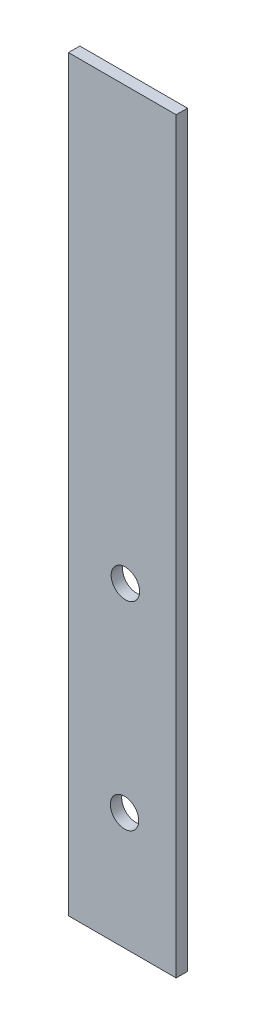
ISO-10303-21;
HEADER;
FILE_DESCRIPTION(('STEP AP214'),'2;1');
FILE_NAME('part.step','',(''),(''),'','','');
FILE_SCHEMA(('AUTOMOTIVE_DESIGN { 1 0 10303 214 1 1 1 1 }'));
ENDSEC;
DATA;
#1=APPLICATION_CONTEXT('core data for automotive mechanical design processes');
#2=APPLICATION_PROTOCOL_DEFINITION('international standard','automotive_design',2000,#1);
#3=PRODUCT_CONTEXT('',#1,'mechanical');
#4=PRODUCT('Part','Part','',(#3));
#5=PRODUCT_RELATED_PRODUCT_CATEGORY('part','',(#4));
#6=PRODUCT_DEFINITION_FORMATION('','',#4);
#7=PRODUCT_DEFINITION_CONTEXT('part definition',#1,'design');
#8=PRODUCT_DEFINITION('design','',#6,#7);
#9=PRODUCT_DEFINITION_SHAPE('','',#8);
#10=(LENGTH_UNIT() NAMED_UNIT(*) SI_UNIT(.MILLI.,.METRE.));
#11=(NAMED_UNIT(*) PLANE_ANGLE_UNIT() SI_UNIT($,.RADIAN.));
#12=(NAMED_UNIT(*) SI_UNIT($,.STERADIAN.) SOLID_ANGLE_UNIT());
#13=UNCERTAINTY_MEASURE_WITH_UNIT(LENGTH_MEASURE(1.E-05),#10,'distance_accuracy_value','');
#14=(GEOMETRIC_REPRESENTATION_CONTEXT(3) GLOBAL_UNCERTAINTY_ASSIGNED_CONTEXT((#13)) GLOBAL_UNIT_ASSIGNED_CONTEXT((#10,
#11,#12)) REPRESENTATION_CONTEXT('',''));
#15=CARTESIAN_POINT('',(0.,0.,0.));
#16=DIRECTION('',(0.,0.,1.));
#17=DIRECTION('',(1.,0.,0.));
#18=AXIS2_PLACEMENT_3D('',#15,#16,#17);
#19=CARTESIAN_POINT('',(0.,0.,4.));
#20=DIRECTION('',(0.,0.,-1.));
#21=DIRECTION('',(-1.,0.,0.));
#22=AXIS2_PLACEMENT_3D('',#19,#20,#21);
#23=PLANE('',#22);
#24=DIRECTION('',(0.,-1.,0.));
#25=VECTOR('',#24,1.);
#26=CARTESIAN_POINT('',(-231.365418272588,-64.4964861712343,4.));
#27=LINE('',#26,#25);
#28=CARTESIAN_POINT('',(-231.365418272588,198.594281617717,4.));
#29=VERTEX_POINT('',#28);
#30=CARTESIAN_POINT('',(-231.365418272588,-64.4964861712343,4.));
#31=VERTEX_POINT('',#30);
#32=EDGE_CURVE('E94',#29,#31,#27,.T.);
#33=ORIENTED_EDGE('',*,*,#32,.T.);
#34=DIRECTION('',(1.,0.,0.));
#35=VECTOR('',#34,1.);
#36=CARTESIAN_POINT('',(-193.465418272588,-64.4964861712342,4.));
#37=LINE('',#36,#35);
#38=CARTESIAN_POINT('',(-193.465418272588,-64.4964861712342,4.));
#39=VERTEX_POINT('',#38);
#40=EDGE_CURVE('E89',#31,#39,#37,.T.);
#41=ORIENTED_EDGE('',*,*,#40,.T.);
#42=DIRECTION('',(0.,1.,0.));
#43=VECTOR('',#42,1.);
#44=CARTESIAN_POINT('',(-193.465418272588,198.594281617717,4.));
#45=LINE('',#44,#43);
#46=CARTESIAN_POINT('',(-193.465418272588,198.594281617717,4.));
#47=VERTEX_POINT('',#46);
#48=EDGE_CURVE('E92',#39,#47,#45,.T.);
#49=ORIENTED_EDGE('',*,*,#48,.T.);
#50=DIRECTION('',(-1.,0.,0.));
#51=VECTOR('',#50,1.);
#52=CARTESIAN_POINT('',(-231.365418272588,198.594281617717,4.));
#53=LINE('',#52,#51);
#54=EDGE_CURVE('E59',#47,#29,#53,.T.);
#55=ORIENTED_EDGE('',*,*,#54,.T.);
#56=EDGE_LOOP('',(#33,#41,#49,#55));
#57=FACE_BOUND('',#56,.T.);
#58=CARTESIAN_POINT('',(-211.634282691747,-23.1738254373147,4.));
#59=DIRECTION('',(0.,0.,1.));
#60=DIRECTION('',(1.,0.,0.));
#61=AXIS2_PLACEMENT_3D('',#58,#59,#60);
#62=CIRCLE('',#61,5.00000000000772);
#63=CARTESIAN_POINT('',(-206.63428269174,-23.1738254373147,4.));
#64=VERTEX_POINT('',#63);
#65=EDGE_CURVE('E114',#64,#64,#62,.T.);
#66=ORIENTED_EDGE('',*,*,#65,.F.);
#67=EDGE_LOOP('',(#66));
#68=FACE_BOUND('',#67,.T.);
#69=CARTESIAN_POINT('',(-211.3424232507,46.8261745626853,4.));
#70=DIRECTION('',(0.,0.,1.));
#71=DIRECTION('',(1.,0.,0.));
#72=AXIS2_PLACEMENT_3D('',#69,#70,#71);
#73=CIRCLE('',#72,5.00000000000773);
#74=CARTESIAN_POINT('',(-206.342423250692,46.8261745626853,4.));
#75=VERTEX_POINT('',#74);
#76=EDGE_CURVE('E136',#75,#75,#73,.T.);
#77=ORIENTED_EDGE('',*,*,#76,.F.);
#78=EDGE_LOOP('',(#77));
#79=FACE_BOUND('',#78,.T.);
#80=ADVANCED_FACE('F41',(#57,#68,#79),#23,.F.);
#81=CARTESIAN_POINT('',(0.,0.,0.));
#82=DIRECTION('',(0.,0.,-1.));
#83=DIRECTION('',(-1.,0.,0.));
#84=AXIS2_PLACEMENT_3D('',#81,#82,#83);
#85=PLANE('',#84);
#86=CARTESIAN_POINT('',(-211.634282691747,-23.1738254373147,0.));
#87=DIRECTION('',(0.,0.,1.));
#88=DIRECTION('',(1.,0.,0.));
#89=AXIS2_PLACEMENT_3D('',#86,#87,#88);
#90=CIRCLE('',#89,5.00000000000772);
#91=CARTESIAN_POINT('',(-206.63428269174,-23.1738254373147,0.));
#92=VERTEX_POINT('',#91);
#93=EDGE_CURVE('E132',#92,#92,#90,.T.);
#94=ORIENTED_EDGE('',*,*,#93,.T.);
#95=EDGE_LOOP('',(#94));
#96=FACE_BOUND('',#95,.T.);
#97=DIRECTION('',(0.,-1.,0.));
#98=VECTOR('',#97,1.);
#99=CARTESIAN_POINT('',(-231.365418272588,-64.4964861712343,0.));
#100=LINE('',#99,#98);
#101=CARTESIAN_POINT('',(-231.365418272588,198.594281617717,0.));
#102=VERTEX_POINT('',#101);
#103=CARTESIAN_POINT('',(-231.365418272588,-64.4964861712343,0.));
#104=VERTEX_POINT('',#103);
#105=EDGE_CURVE('E110',#102,#104,#100,.T.);
#106=ORIENTED_EDGE('',*,*,#105,.F.);
#107=DIRECTION('',(-1.,0.,0.));
#108=VECTOR('',#107,1.);
#109=CARTESIAN_POINT('',(-231.365418272588,198.594281617717,0.));
#110=LINE('',#109,#108);
#111=CARTESIAN_POINT('',(-193.465418272588,198.594281617717,0.));
#112=VERTEX_POINT('',#111);
#113=EDGE_CURVE('E82',#112,#102,#110,.T.);
#114=ORIENTED_EDGE('',*,*,#113,.F.);
#115=DIRECTION('',(0.,1.,0.));
#116=VECTOR('',#115,1.);
#117=CARTESIAN_POINT('',(-193.465418272588,198.594281617717,0.));
#118=LINE('',#117,#116);
#119=CARTESIAN_POINT('',(-193.465418272588,-64.4964861712342,0.));
#120=VERTEX_POINT('',#119);
#121=EDGE_CURVE('E76',#120,#112,#118,.T.);
#122=ORIENTED_EDGE('',*,*,#121,.F.);
#123=DIRECTION('',(1.,0.,0.));
#124=VECTOR('',#123,1.);
#125=CARTESIAN_POINT('',(-193.465418272588,-64.4964861712342,0.));
#126=LINE('',#125,#124);
#127=EDGE_CURVE('E99',#104,#120,#126,.T.);
#128=ORIENTED_EDGE('',*,*,#127,.F.);
#129=EDGE_LOOP('',(#106,#114,#122,#128));
#130=FACE_BOUND('',#129,.T.);
#131=CARTESIAN_POINT('',(-211.3424232507,46.8261745626853,0.));
#132=DIRECTION('',(0.,0.,1.));
#133=DIRECTION('',(1.,0.,0.));
#134=AXIS2_PLACEMENT_3D('',#131,#132,#133);
#135=CIRCLE('',#134,5.00000000000773);
#136=CARTESIAN_POINT('',(-206.342423250692,46.8261745626853,0.));
#137=VERTEX_POINT('',#136);
#138=EDGE_CURVE('E140',#137,#137,#135,.T.);
#139=ORIENTED_EDGE('',*,*,#138,.T.);
#140=EDGE_LOOP('',(#139));
#141=FACE_BOUND('',#140,.T.);
#142=ADVANCED_FACE('F127',(#96,#130,#141),#85,.T.);
#143=CARTESIAN_POINT('',(-231.365418272588,-64.4964861712343,4.));
#144=DIRECTION('',(1.,0.,0.));
#145=DIRECTION('',(0.,0.,-1.));
#146=AXIS2_PLACEMENT_3D('',#143,#144,#145);
#147=PLANE('',#146);
#148=ORIENTED_EDGE('',*,*,#105,.T.);
#149=DIRECTION('',(0.,0.,-1.));
#150=VECTOR('',#149,1.);
#151=CARTESIAN_POINT('',(-231.365418272588,-64.4964861712343,4.));
#152=LINE('',#151,#150);
#153=EDGE_CURVE('E11',#31,#104,#152,.T.);
#154=ORIENTED_EDGE('',*,*,#153,.F.);
#155=ORIENTED_EDGE('',*,*,#32,.F.);
#156=DIRECTION('',(0.,0.,-1.));
#157=VECTOR('',#156,1.);
#158=CARTESIAN_POINT('',(-231.365418272588,198.594281617717,4.));
#159=LINE('',#158,#157);
#160=EDGE_CURVE('E106',#29,#102,#159,.T.);
#161=ORIENTED_EDGE('',*,*,#160,.T.);
#162=EDGE_LOOP('',(#148,#154,#155,#161));
#163=FACE_BOUND('',#162,.T.);
#164=ADVANCED_FACE('F43',(#163),#147,.F.);
#165=CARTESIAN_POINT('',(-193.465418272588,-64.4964861712342,4.));
#166=DIRECTION('',(0.,1.,0.));
#167=DIRECTION('',(-1.,0.,0.));
#168=AXIS2_PLACEMENT_3D('',#165,#166,#167);
#169=PLANE('',#168);
#170=ORIENTED_EDGE('',*,*,#127,.T.);
#171=DIRECTION('',(0.,0.,-1.));
#172=VECTOR('',#171,1.);
#173=CARTESIAN_POINT('',(-193.465418272588,-64.4964861712342,4.));
#174=LINE('',#173,#172);
#175=EDGE_CURVE('E51',#39,#120,#174,.T.);
#176=ORIENTED_EDGE('',*,*,#175,.F.);
#177=ORIENTED_EDGE('',*,*,#40,.F.);
#178=ORIENTED_EDGE('',*,*,#153,.T.);
#179=EDGE_LOOP('',(#170,#176,#177,#178));
#180=FACE_BOUND('',#179,.T.);
#181=ADVANCED_FACE('F98',(#180),#169,.F.);
#182=CARTESIAN_POINT('',(-193.465418272588,198.594281617717,4.));
#183=DIRECTION('',(-1.,0.,0.));
#184=DIRECTION('',(0.,-1.,0.));
#185=AXIS2_PLACEMENT_3D('',#182,#183,#184);
#186=PLANE('',#185);
#187=ORIENTED_EDGE('',*,*,#121,.T.);
#188=DIRECTION('',(0.,0.,-1.));
#189=VECTOR('',#188,1.);
#190=CARTESIAN_POINT('',(-193.465418272588,198.594281617717,4.));
#191=LINE('',#190,#189);
#192=EDGE_CURVE('E101',#47,#112,#191,.T.);
#193=ORIENTED_EDGE('',*,*,#192,.F.);
#194=ORIENTED_EDGE('',*,*,#48,.F.);
#195=ORIENTED_EDGE('',*,*,#175,.T.);
#196=EDGE_LOOP('',(#187,#193,#194,#195));
#197=FACE_BOUND('',#196,.T.);
#198=ADVANCED_FACE('F102',(#197),#186,.F.);
#199=CARTESIAN_POINT('',(-231.365418272588,198.594281617717,4.));
#200=DIRECTION('',(0.,-1.,0.));
#201=DIRECTION('',(0.,0.,-1.));
#202=AXIS2_PLACEMENT_3D('',#199,#200,#201);
#203=PLANE('',#202);
#204=ORIENTED_EDGE('',*,*,#113,.T.);
#205=ORIENTED_EDGE('',*,*,#160,.F.);
#206=ORIENTED_EDGE('',*,*,#54,.F.);
#207=ORIENTED_EDGE('',*,*,#192,.T.);
#208=EDGE_LOOP('',(#204,#205,#206,#207));
#209=FACE_BOUND('',#208,.T.);
#210=ADVANCED_FACE('F124',(#209),#203,.F.);
#211=CARTESIAN_POINT('',(-211.634282691747,-23.1738254373147,4.));
#212=DIRECTION('',(0.,0.,-1.));
#213=DIRECTION('',(-1.,0.,0.));
#214=AXIS2_PLACEMENT_3D('',#211,#212,#213);
#215=CYLINDRICAL_SURFACE('',#214,5.00000000000772);
#216=ORIENTED_EDGE('',*,*,#65,.T.);
#217=EDGE_LOOP('',(#216));
#218=FACE_BOUND('',#217,.T.);
#219=ORIENTED_EDGE('',*,*,#93,.F.);
#220=EDGE_LOOP('',(#219));
#221=FACE_BOUND('',#220,.T.);
#222=ADVANCED_FACE('F159',(#218,#221),#215,.F.);
#223=CARTESIAN_POINT('',(-211.3424232507,46.8261745626853,4.));
#224=DIRECTION('',(0.,0.,-1.));
#225=DIRECTION('',(-1.,0.,0.));
#226=AXIS2_PLACEMENT_3D('',#223,#224,#225);
#227=CYLINDRICAL_SURFACE('',#226,5.00000000000773);
#228=ORIENTED_EDGE('',*,*,#76,.T.);
#229=EDGE_LOOP('',(#228));
#230=FACE_BOUND('',#229,.T.);
#231=ORIENTED_EDGE('',*,*,#138,.F.);
#232=EDGE_LOOP('',(#231));
#233=FACE_BOUND('',#232,.T.);
#234=ADVANCED_FACE('F148',(#230,#233),#227,.F.);
#235=CLOSED_SHELL('',(#80,#142,#164,#181,#198,#210,#222,#234));
#236=MANIFOLD_SOLID_BREP('B2',#235);
#237=ADVANCED_BREP_SHAPE_REPRESENTATION('',(#18,#236),#14);
#238=SHAPE_DEFINITION_REPRESENTATION(#9,#237);
ENDSEC;
END-ISO-10303-21;
